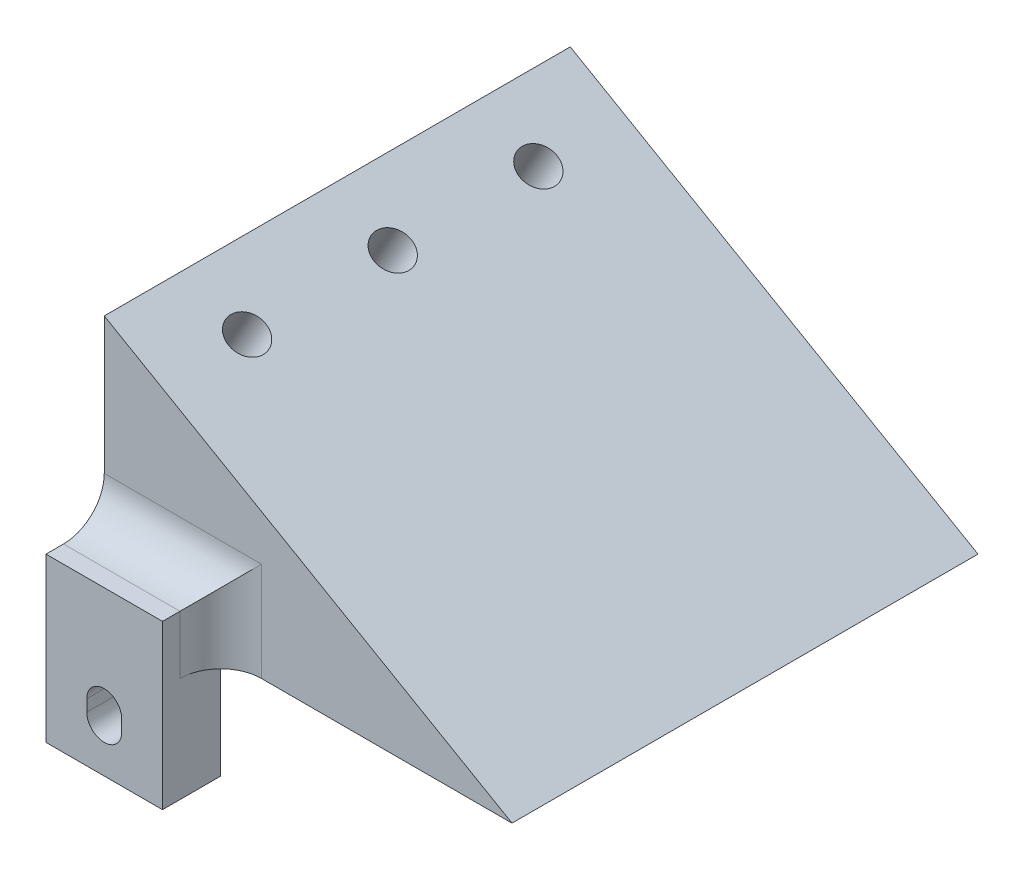
ISO-10303-21;
HEADER;
FILE_DESCRIPTION(('STEP AP214'),'2;1');
FILE_NAME('part.step','',(''),(''),'','','');
FILE_SCHEMA(('AUTOMOTIVE_DESIGN { 1 0 10303 214 1 1 1 1 }'));
ENDSEC;
DATA;
#1=APPLICATION_CONTEXT('core data for automotive mechanical design processes');
#2=APPLICATION_PROTOCOL_DEFINITION('international standard','automotive_design',2000,#1);
#3=PRODUCT_CONTEXT('',#1,'mechanical');
#4=PRODUCT('Part','Part','',(#3));
#5=PRODUCT_RELATED_PRODUCT_CATEGORY('part','',(#4));
#6=PRODUCT_DEFINITION_FORMATION('','',#4);
#7=PRODUCT_DEFINITION_CONTEXT('part definition',#1,'design');
#8=PRODUCT_DEFINITION('design','',#6,#7);
#9=PRODUCT_DEFINITION_SHAPE('','',#8);
#10=(LENGTH_UNIT() NAMED_UNIT(*) SI_UNIT(.MILLI.,.METRE.));
#11=(NAMED_UNIT(*) PLANE_ANGLE_UNIT() SI_UNIT($,.RADIAN.));
#12=(NAMED_UNIT(*) SI_UNIT($,.STERADIAN.) SOLID_ANGLE_UNIT());
#13=UNCERTAINTY_MEASURE_WITH_UNIT(LENGTH_MEASURE(1.E-05),#10,'distance_accuracy_value','');
#14=(GEOMETRIC_REPRESENTATION_CONTEXT(3) GLOBAL_UNCERTAINTY_ASSIGNED_CONTEXT((#13)) GLOBAL_UNIT_ASSIGNED_CONTEXT((#10,
#11,#12)) REPRESENTATION_CONTEXT('',''));
#15=CARTESIAN_POINT('',(0.,0.,0.));
#16=DIRECTION('',(0.,0.,1.));
#17=DIRECTION('',(1.,0.,0.));
#18=AXIS2_PLACEMENT_3D('',#15,#16,#17);
#19=CARTESIAN_POINT('',(0.,0.,0.));
#20=DIRECTION('',(0.,0.,1.));
#21=DIRECTION('',(-1.,0.,0.));
#22=AXIS2_PLACEMENT_3D('',#19,#20,#21);
#23=PLANE('',#22);
#24=DIRECTION('',(1.,0.,0.));
#25=VECTOR('',#24,1.);
#26=CARTESIAN_POINT('',(70.,0.,0.));
#27=LINE('',#26,#25);
#28=CARTESIAN_POINT('',(0.,0.,0.));
#29=VERTEX_POINT('',#28);
#30=CARTESIAN_POINT('',(20.,0.,0.));
#31=VERTEX_POINT('',#30);
#32=EDGE_CURVE('E331',#29,#31,#27,.T.);
#33=ORIENTED_EDGE('',*,*,#32,.F.);
#34=DIRECTION('',(0.,-1.,0.));
#35=VECTOR('',#34,1.);
#36=CARTESIAN_POINT('',(0.,10.,0.));
#37=LINE('',#36,#35);
#38=CARTESIAN_POINT('',(0.,-18.,0.));
#39=VERTEX_POINT('',#38);
#40=EDGE_CURVE('E241',#29,#39,#37,.T.);
#41=ORIENTED_EDGE('',*,*,#40,.T.);
#42=DIRECTION('',(1.,0.,0.));
#43=VECTOR('',#42,1.);
#44=CARTESIAN_POINT('',(20.,-18.,0.));
#45=LINE('',#44,#43);
#46=CARTESIAN_POINT('',(20.,-18.,0.));
#47=VERTEX_POINT('',#46);
#48=EDGE_CURVE('E246',#39,#47,#45,.T.);
#49=ORIENTED_EDGE('',*,*,#48,.T.);
#50=DIRECTION('',(0.,1.,0.));
#51=VECTOR('',#50,1.);
#52=CARTESIAN_POINT('',(20.,10.,0.));
#53=LINE('',#52,#51);
#54=EDGE_CURVE('E257',#47,#31,#53,.T.);
#55=ORIENTED_EDGE('',*,*,#54,.T.);
#56=EDGE_LOOP('',(#33,#41,#49,#55));
#57=FACE_BOUND('',#56,.T.);
#58=DIRECTION('',(0.,-1.,0.));
#59=VECTOR('',#58,1.);
#60=CARTESIAN_POINT('',(13.,0.,0.));
#61=LINE('',#60,#59);
#62=CARTESIAN_POINT('',(13.,-8.,0.));
#63=VERTEX_POINT('',#62);
#64=CARTESIAN_POINT('',(13.,-10.,0.));
#65=VERTEX_POINT('',#64);
#66=EDGE_CURVE('E235',#63,#65,#61,.T.);
#67=ORIENTED_EDGE('',*,*,#66,.T.);
#68=CARTESIAN_POINT('',(10.,-10.,0.));
#69=DIRECTION('',(0.,0.,1.));
#70=DIRECTION('',(1.,0.,0.));
#71=AXIS2_PLACEMENT_3D('',#68,#69,#70);
#72=CIRCLE('',#71,3.);
#73=CARTESIAN_POINT('',(7.,-10.,0.));
#74=VERTEX_POINT('',#73);
#75=EDGE_CURVE('E238',#65,#74,#72,.F.);
#76=ORIENTED_EDGE('',*,*,#75,.T.);
#77=DIRECTION('',(0.,1.,0.));
#78=VECTOR('',#77,1.);
#79=CARTESIAN_POINT('',(6.99999999999999,0.,0.));
#80=LINE('',#79,#78);
#81=CARTESIAN_POINT('',(7.,-8.,0.));
#82=VERTEX_POINT('',#81);
#83=EDGE_CURVE('E230',#74,#82,#80,.T.);
#84=ORIENTED_EDGE('',*,*,#83,.T.);
#85=CARTESIAN_POINT('',(10.,-8.,0.));
#86=DIRECTION('',(0.,0.,1.));
#87=DIRECTION('',(1.,0.,0.));
#88=AXIS2_PLACEMENT_3D('',#85,#86,#87);
#89=CIRCLE('',#88,3.);
#90=EDGE_CURVE('E206',#82,#63,#89,.F.);
#91=ORIENTED_EDGE('',*,*,#90,.T.);
#92=EDGE_LOOP('',(#67,#76,#84,#91));
#93=FACE_BOUND('',#92,.T.);
#94=ADVANCED_FACE('F37',(#57,#93),#23,.T.);
#95=CARTESIAN_POINT('',(0.,0.,-10.));
#96=DIRECTION('',(0.,0.,1.));
#97=DIRECTION('',(-1.,0.,0.));
#98=AXIS2_PLACEMENT_3D('',#95,#96,#97);
#99=PLANE('',#98);
#100=DIRECTION('',(0.,-1.,0.));
#101=VECTOR('',#100,1.);
#102=CARTESIAN_POINT('',(0.,10.,-10.));
#103=LINE('',#102,#101);
#104=CARTESIAN_POINT('',(0.,10.,-10.));
#105=VERTEX_POINT('',#104);
#106=CARTESIAN_POINT('',(0.,-18.,-10.));
#107=VERTEX_POINT('',#106);
#108=EDGE_CURVE('E242',#105,#107,#103,.T.);
#109=ORIENTED_EDGE('',*,*,#108,.F.);
#110=DIRECTION('',(-1.,0.,0.));
#111=VECTOR('',#110,1.);
#112=CARTESIAN_POINT('',(20.,10.,-10.));
#113=LINE('',#112,#111);
#114=CARTESIAN_POINT('',(20.,10.,-10.));
#115=VERTEX_POINT('',#114);
#116=EDGE_CURVE('E245',#115,#105,#113,.T.);
#117=ORIENTED_EDGE('',*,*,#116,.F.);
#118=DIRECTION('',(0.,1.,0.));
#119=VECTOR('',#118,1.);
#120=CARTESIAN_POINT('',(20.,10.,-10.));
#121=LINE('',#120,#119);
#122=CARTESIAN_POINT('',(20.,-18.,-10.));
#123=VERTEX_POINT('',#122);
#124=EDGE_CURVE('E249',#123,#115,#121,.T.);
#125=ORIENTED_EDGE('',*,*,#124,.F.);
#126=DIRECTION('',(1.,0.,0.));
#127=VECTOR('',#126,1.);
#128=CARTESIAN_POINT('',(20.,-18.,-10.));
#129=LINE('',#128,#127);
#130=EDGE_CURVE('E252',#107,#123,#129,.T.);
#131=ORIENTED_EDGE('',*,*,#130,.F.);
#132=EDGE_LOOP('',(#109,#117,#125,#131));
#133=FACE_BOUND('',#132,.T.);
#134=CARTESIAN_POINT('',(10.,-10.,-9.99999999999999));
#135=DIRECTION('',(0.,0.,1.));
#136=DIRECTION('',(1.,0.,0.));
#137=AXIS2_PLACEMENT_3D('',#134,#135,#136);
#138=CIRCLE('',#137,3.);
#139=CARTESIAN_POINT('',(7.,-10.,-10.));
#140=VERTEX_POINT('',#139);
#141=CARTESIAN_POINT('',(13.,-10.,-9.99999999999999));
#142=VERTEX_POINT('',#141);
#143=EDGE_CURVE('E219',#140,#142,#138,.T.);
#144=ORIENTED_EDGE('',*,*,#143,.T.);
#145=DIRECTION('',(0.,1.,0.));
#146=VECTOR('',#145,1.);
#147=CARTESIAN_POINT('',(13.,-10.,-9.99999999999999));
#148=LINE('',#147,#146);
#149=CARTESIAN_POINT('',(13.,-8.,-9.99999999999999));
#150=VERTEX_POINT('',#149);
#151=EDGE_CURVE('E223',#142,#150,#148,.T.);
#152=ORIENTED_EDGE('',*,*,#151,.T.);
#153=CARTESIAN_POINT('',(10.,-8.,-9.99999999999999));
#154=DIRECTION('',(0.,0.,1.));
#155=DIRECTION('',(1.,0.,0.));
#156=AXIS2_PLACEMENT_3D('',#153,#154,#155);
#157=CIRCLE('',#156,3.);
#158=CARTESIAN_POINT('',(7.,-8.,-9.99999999999999));
#159=VERTEX_POINT('',#158);
#160=EDGE_CURVE('E203',#150,#159,#157,.T.);
#161=ORIENTED_EDGE('',*,*,#160,.T.);
#162=DIRECTION('',(0.,-1.,0.));
#163=VECTOR('',#162,1.);
#164=CARTESIAN_POINT('',(7.,-10.,-9.99999999999999));
#165=LINE('',#164,#163);
#166=EDGE_CURVE('E214',#159,#140,#165,.T.);
#167=ORIENTED_EDGE('',*,*,#166,.T.);
#168=EDGE_LOOP('',(#144,#152,#161,#167));
#169=FACE_BOUND('',#168,.T.);
#170=ADVANCED_FACE('F221',(#133,#169),#99,.F.);
#171=CARTESIAN_POINT('',(0.,0.,0.));
#172=DIRECTION('',(0.,0.,-1.));
#173=DIRECTION('',(-1.,0.,0.));
#174=AXIS2_PLACEMENT_3D('',#171,#172,#173);
#175=PLANE('',#174);
#176=CARTESIAN_POINT('',(27.,0.,0.));
#177=VERTEX_POINT('',#176);
#178=CARTESIAN_POINT('',(70.,0.,0.));
#179=VERTEX_POINT('',#178);
#180=EDGE_CURVE('E320',#177,#179,#27,.T.);
#181=ORIENTED_EDGE('',*,*,#180,.F.);
#182=DIRECTION('',(0.,1.,0.));
#183=VECTOR('',#182,1.);
#184=CARTESIAN_POINT('',(27.,10.,0.));
#185=LINE('',#184,#183);
#186=CARTESIAN_POINT('',(27.,17.,0.));
#187=VERTEX_POINT('',#186);
#188=EDGE_CURVE('E373',#177,#187,#185,.T.);
#189=ORIENTED_EDGE('',*,*,#188,.T.);
#190=DIRECTION('',(-1.,0.,0.));
#191=VECTOR('',#190,1.);
#192=CARTESIAN_POINT('',(0.,17.,0.));
#193=LINE('',#192,#191);
#194=CARTESIAN_POINT('',(0.,17.,0.));
#195=VERTEX_POINT('',#194);
#196=EDGE_CURVE('E371',#187,#195,#193,.T.);
#197=ORIENTED_EDGE('',*,*,#196,.T.);
#198=DIRECTION('',(0.,-1.,0.));
#199=VECTOR('',#198,1.);
#200=CARTESIAN_POINT('',(0.,0.,0.));
#201=LINE('',#200,#199);
#202=CARTESIAN_POINT('',(0.,40.4145188432732,0.));
#203=VERTEX_POINT('',#202);
#204=EDGE_CURVE('E335',#203,#195,#201,.T.);
#205=ORIENTED_EDGE('',*,*,#204,.F.);
#206=DIRECTION('',(-0.866025403784442,0.499999999999995,0.));
#207=VECTOR('',#206,1.);
#208=CARTESIAN_POINT('',(0.,40.4145188432732,0.));
#209=LINE('',#208,#207);
#210=EDGE_CURVE('E333',#179,#203,#209,.T.);
#211=ORIENTED_EDGE('',*,*,#210,.F.);
#212=EDGE_LOOP('',(#181,#189,#197,#205,#211));
#213=FACE_BOUND('',#212,.T.);
#214=ADVANCED_FACE('F390',(#213),#175,.T.);
#215=CARTESIAN_POINT('',(0.,0.,80.));
#216=DIRECTION('',(0.,0.,-1.));
#217=DIRECTION('',(-1.,0.,0.));
#218=AXIS2_PLACEMENT_3D('',#215,#216,#217);
#219=PLANE('',#218);
#220=DIRECTION('',(-1.,0.,0.));
#221=VECTOR('',#220,1.);
#222=CARTESIAN_POINT('',(20.,17.,80.));
#223=LINE('',#222,#221);
#224=CARTESIAN_POINT('',(0.,17.,80.));
#225=VERTEX_POINT('',#224);
#226=CARTESIAN_POINT('',(27.,17.,80.));
#227=VERTEX_POINT('',#226);
#228=EDGE_CURVE('E351',#225,#227,#223,.F.);
#229=ORIENTED_EDGE('',*,*,#228,.T.);
#230=DIRECTION('',(0.,1.,0.));
#231=VECTOR('',#230,1.);
#232=CARTESIAN_POINT('',(27.,0.,80.));
#233=LINE('',#232,#231);
#234=CARTESIAN_POINT('',(27.,0.,80.));
#235=VERTEX_POINT('',#234);
#236=EDGE_CURVE('E353',#227,#235,#233,.F.);
#237=ORIENTED_EDGE('',*,*,#236,.T.);
#238=DIRECTION('',(1.,0.,0.));
#239=VECTOR('',#238,1.);
#240=CARTESIAN_POINT('',(70.,0.,80.));
#241=LINE('',#240,#239);
#242=CARTESIAN_POINT('',(70.,0.,80.));
#243=VERTEX_POINT('',#242);
#244=EDGE_CURVE('E325',#235,#243,#241,.T.);
#245=ORIENTED_EDGE('',*,*,#244,.T.);
#246=DIRECTION('',(-0.866025403784442,0.499999999999995,0.));
#247=VECTOR('',#246,1.);
#248=CARTESIAN_POINT('',(0.,40.4145188432732,80.));
#249=LINE('',#248,#247);
#250=CARTESIAN_POINT('',(0.,40.4145188432732,80.));
#251=VERTEX_POINT('',#250);
#252=EDGE_CURVE('E324',#243,#251,#249,.T.);
#253=ORIENTED_EDGE('',*,*,#252,.T.);
#254=DIRECTION('',(0.,-1.,0.));
#255=VECTOR('',#254,1.);
#256=CARTESIAN_POINT('',(0.,0.,80.));
#257=LINE('',#256,#255);
#258=EDGE_CURVE('E327',#251,#225,#257,.T.);
#259=ORIENTED_EDGE('',*,*,#258,.T.);
#260=EDGE_LOOP('',(#229,#237,#245,#253,#259));
#261=FACE_BOUND('',#260,.T.);
#262=ADVANCED_FACE('F530',(#261),#219,.F.);
#263=CARTESIAN_POINT('',(70.,0.,80.));
#264=DIRECTION('',(0.,1.,0.));
#265=DIRECTION('',(-1.,0.,0.));
#266=AXIS2_PLACEMENT_3D('',#263,#264,#265);
#267=PLANE('',#266);
#268=ORIENTED_EDGE('',*,*,#32,.T.);
#269=DIRECTION('',(0.,0.,1.));
#270=VECTOR('',#269,1.);
#271=CARTESIAN_POINT('',(20.,0.,-10.));
#272=LINE('',#271,#270);
#273=CARTESIAN_POINT('',(20.,0.,-7.));
#274=VERTEX_POINT('',#273);
#275=EDGE_CURVE('E59',#274,#31,#272,.T.);
#276=ORIENTED_EDGE('',*,*,#275,.F.);
#277=CARTESIAN_POINT('',(27.,0.,-7.));
#278=DIRECTION('',(0.,1.,0.));
#279=DIRECTION('',(-1.,0.,0.));
#280=AXIS2_PLACEMENT_3D('',#277,#278,#279);
#281=CIRCLE('',#280,7.);
#282=EDGE_CURVE('E46',#274,#177,#281,.T.);
#283=ORIENTED_EDGE('',*,*,#282,.T.);
#284=ORIENTED_EDGE('',*,*,#180,.T.);
#285=DIRECTION('',(0.,0.,-1.));
#286=VECTOR('',#285,1.);
#287=CARTESIAN_POINT('',(70.,0.,80.));
#288=LINE('',#287,#286);
#289=EDGE_CURVE('E342',#243,#179,#288,.T.);
#290=ORIENTED_EDGE('',*,*,#289,.F.);
#291=ORIENTED_EDGE('',*,*,#244,.F.);
#292=CARTESIAN_POINT('',(27.,0.,87.));
#293=DIRECTION('',(0.,1.,0.));
#294=DIRECTION('',(-1.,0.,0.));
#295=AXIS2_PLACEMENT_3D('',#292,#293,#294);
#296=CIRCLE('',#295,7.);
#297=CARTESIAN_POINT('',(20.,0.,87.));
#298=VERTEX_POINT('',#297);
#299=EDGE_CURVE('E357',#235,#298,#296,.T.);
#300=ORIENTED_EDGE('',*,*,#299,.T.);
#301=DIRECTION('',(0.,0.,1.));
#302=VECTOR('',#301,1.);
#303=CARTESIAN_POINT('',(20.,0.,80.));
#304=LINE('',#303,#302);
#305=CARTESIAN_POINT('',(20.,0.,80.));
#306=VERTEX_POINT('',#305);
#307=EDGE_CURVE('E345',#306,#298,#304,.T.);
#308=ORIENTED_EDGE('',*,*,#307,.F.);
#309=CARTESIAN_POINT('',(0.,0.,80.));
#310=VERTEX_POINT('',#309);
#311=EDGE_CURVE('E321',#310,#306,#241,.T.);
#312=ORIENTED_EDGE('',*,*,#311,.F.);
#313=DIRECTION('',(0.,0.,-1.));
#314=VECTOR('',#313,1.);
#315=CARTESIAN_POINT('',(0.,0.,80.));
#316=LINE('',#315,#314);
#317=EDGE_CURVE('E330',#310,#29,#316,.T.);
#318=ORIENTED_EDGE('',*,*,#317,.T.);
#319=EDGE_LOOP('',(#268,#276,#283,#284,#290,#291,#300,#308,#312,#318));
#320=FACE_BOUND('',#319,.T.);
#321=ADVANCED_FACE('F383',(#320),#267,.F.);
#322=CARTESIAN_POINT('',(0.,40.4145188432732,80.));
#323=DIRECTION('',(-0.499999999999995,-0.866025403784442,0.));
#324=DIRECTION('',(0.866025403784442,-0.499999999999995,0.));
#325=AXIS2_PLACEMENT_3D('',#322,#323,#324);
#326=PLANE('',#325);
#327=CARTESIAN_POINT('',(9.52627944162887,34.9145188432733,15.));
#328=DIRECTION('',(0.499999999999995,0.866025403784442,0.));
#329=DIRECTION('',(-0.866025403784442,0.499999999999995,0.));
#330=AXIS2_PLACEMENT_3D('',#327,#328,#329);
#331=CIRCLE('',#330,3.2);
#332=CARTESIAN_POINT('',(6.75499814951865,36.5145188432733,15.));
#333=VERTEX_POINT('',#332);
#334=EDGE_CURVE('E501',#333,#333,#331,.T.);
#335=ORIENTED_EDGE('',*,*,#334,.F.);
#336=EDGE_LOOP('',(#335));
#337=FACE_BOUND('',#336,.T.);
#338=CARTESIAN_POINT('',(9.52627944162887,34.9145188432733,65.));
#339=DIRECTION('',(0.499999999999995,0.866025403784442,0.));
#340=DIRECTION('',(-0.866025403784442,0.499999999999995,0.));
#341=AXIS2_PLACEMENT_3D('',#338,#339,#340);
#342=CIRCLE('',#341,3.19999999999999);
#343=CARTESIAN_POINT('',(6.75499814951866,36.5145188432733,65.));
#344=VERTEX_POINT('',#343);
#345=EDGE_CURVE('E509',#344,#344,#342,.T.);
#346=ORIENTED_EDGE('',*,*,#345,.F.);
#347=EDGE_LOOP('',(#346));
#348=FACE_BOUND('',#347,.T.);
#349=CARTESIAN_POINT('',(9.52627944162887,34.9145188432733,40.));
#350=DIRECTION('',(0.499999999999995,0.866025403784442,0.));
#351=DIRECTION('',(-0.866025403784442,0.499999999999995,0.));
#352=AXIS2_PLACEMENT_3D('',#349,#350,#351);
#353=CIRCLE('',#352,3.2);
#354=CARTESIAN_POINT('',(6.75499814951865,36.5145188432733,40.));
#355=VERTEX_POINT('',#354);
#356=EDGE_CURVE('E515',#355,#355,#353,.T.);
#357=ORIENTED_EDGE('',*,*,#356,.F.);
#358=EDGE_LOOP('',(#357));
#359=FACE_BOUND('',#358,.T.);
#360=ORIENTED_EDGE('',*,*,#210,.T.);
#361=DIRECTION('',(0.,0.,-1.));
#362=VECTOR('',#361,1.);
#363=CARTESIAN_POINT('',(0.,40.4145188432732,80.));
#364=LINE('',#363,#362);
#365=EDGE_CURVE('E339',#251,#203,#364,.T.);
#366=ORIENTED_EDGE('',*,*,#365,.F.);
#367=ORIENTED_EDGE('',*,*,#252,.F.);
#368=ORIENTED_EDGE('',*,*,#289,.T.);
#369=EDGE_LOOP('',(#360,#366,#367,#368));
#370=FACE_BOUND('',#369,.T.);
#371=ADVANCED_FACE('F403',(#337,#348,#359,#370),#326,.F.);
#372=CARTESIAN_POINT('',(0.,0.,80.));
#373=DIRECTION('',(1.,0.,0.));
#374=DIRECTION('',(0.,0.,-1.));
#375=AXIS2_PLACEMENT_3D('',#372,#373,#374);
#376=PLANE('',#375);
#377=ORIENTED_EDGE('',*,*,#204,.T.);
#378=CARTESIAN_POINT('',(0.,17.,-7.));
#379=DIRECTION('',(1.,0.,0.));
#380=DIRECTION('',(0.,0.,-1.));
#381=AXIS2_PLACEMENT_3D('',#378,#379,#380);
#382=CIRCLE('',#381,7.);
#383=CARTESIAN_POINT('',(0.,10.,-7.));
#384=VERTEX_POINT('',#383);
#385=EDGE_CURVE('E11',#195,#384,#382,.T.);
#386=ORIENTED_EDGE('',*,*,#385,.T.);
#387=DIRECTION('',(0.,0.,1.));
#388=VECTOR('',#387,1.);
#389=CARTESIAN_POINT('',(0.,10.,-10.));
#390=LINE('',#389,#388);
#391=EDGE_CURVE('E269',#105,#384,#390,.T.);
#392=ORIENTED_EDGE('',*,*,#391,.F.);
#393=ORIENTED_EDGE('',*,*,#108,.T.);
#394=DIRECTION('',(0.,0.,1.));
#395=VECTOR('',#394,1.);
#396=CARTESIAN_POINT('',(0.,-18.,-10.));
#397=LINE('',#396,#395);
#398=EDGE_CURVE('E255',#107,#39,#397,.T.);
#399=ORIENTED_EDGE('',*,*,#398,.T.);
#400=ORIENTED_EDGE('',*,*,#40,.F.);
#401=ORIENTED_EDGE('',*,*,#317,.F.);
#402=DIRECTION('',(0.,-1.,0.));
#403=VECTOR('',#402,1.);
#404=CARTESIAN_POINT('',(0.,10.,80.));
#405=LINE('',#404,#403);
#406=CARTESIAN_POINT('',(0.,-18.,80.));
#407=VERTEX_POINT('',#406);
#408=EDGE_CURVE('E303',#310,#407,#405,.T.);
#409=ORIENTED_EDGE('',*,*,#408,.T.);
#410=DIRECTION('',(0.,0.,-1.));
#411=VECTOR('',#410,1.);
#412=CARTESIAN_POINT('',(0.,-18.,90.));
#413=LINE('',#412,#411);
#414=CARTESIAN_POINT('',(0.,-18.,90.));
#415=VERTEX_POINT('',#414);
#416=EDGE_CURVE('E317',#415,#407,#413,.T.);
#417=ORIENTED_EDGE('',*,*,#416,.F.);
#418=DIRECTION('',(0.,-1.,0.));
#419=VECTOR('',#418,1.);
#420=CARTESIAN_POINT('',(0.,10.,90.));
#421=LINE('',#420,#419);
#422=CARTESIAN_POINT('',(0.,10.,90.));
#423=VERTEX_POINT('',#422);
#424=EDGE_CURVE('E292',#423,#415,#421,.T.);
#425=ORIENTED_EDGE('',*,*,#424,.F.);
#426=DIRECTION('',(0.,0.,-1.));
#427=VECTOR('',#426,1.);
#428=CARTESIAN_POINT('',(0.,10.,90.));
#429=LINE('',#428,#427);
#430=CARTESIAN_POINT('',(0.,10.,87.));
#431=VERTEX_POINT('',#430);
#432=EDGE_CURVE('E302',#423,#431,#429,.T.);
#433=ORIENTED_EDGE('',*,*,#432,.T.);
#434=CARTESIAN_POINT('',(0.,17.,87.));
#435=DIRECTION('',(1.,0.,0.));
#436=DIRECTION('',(0.,0.,-1.));
#437=AXIS2_PLACEMENT_3D('',#434,#435,#436);
#438=CIRCLE('',#437,7.);
#439=EDGE_CURVE('E359',#431,#225,#438,.T.);
#440=ORIENTED_EDGE('',*,*,#439,.T.);
#441=ORIENTED_EDGE('',*,*,#258,.F.);
#442=ORIENTED_EDGE('',*,*,#365,.T.);
#443=EDGE_LOOP('',(#377,#386,#392,#393,#399,#400,#401,#409,#417,#425,#433,#440,#441,#442));
#444=FACE_BOUND('',#443,.T.);
#445=ADVANCED_FACE('F398',(#444),#376,.F.);
#446=CARTESIAN_POINT('',(20.,-18.,90.));
#447=DIRECTION('',(0.,1.,0.));
#448=DIRECTION('',(-1.,0.,0.));
#449=AXIS2_PLACEMENT_3D('',#446,#447,#448);
#450=PLANE('',#449);
#451=DIRECTION('',(1.,0.,0.));
#452=VECTOR('',#451,1.);
#453=CARTESIAN_POINT('',(20.,-18.,80.));
#454=LINE('',#453,#452);
#455=CARTESIAN_POINT('',(20.,-18.,80.));
#456=VERTEX_POINT('',#455);
#457=EDGE_CURVE('E305',#407,#456,#454,.T.);
#458=ORIENTED_EDGE('',*,*,#457,.T.);
#459=DIRECTION('',(0.,0.,-1.));
#460=VECTOR('',#459,1.);
#461=CARTESIAN_POINT('',(20.,-18.,90.));
#462=LINE('',#461,#460);
#463=CARTESIAN_POINT('',(20.,-18.,90.));
#464=VERTEX_POINT('',#463);
#465=EDGE_CURVE('E314',#464,#456,#462,.T.);
#466=ORIENTED_EDGE('',*,*,#465,.F.);
#467=DIRECTION('',(1.,0.,0.));
#468=VECTOR('',#467,1.);
#469=CARTESIAN_POINT('',(20.,-18.,90.));
#470=LINE('',#469,#468);
#471=EDGE_CURVE('E295',#415,#464,#470,.T.);
#472=ORIENTED_EDGE('',*,*,#471,.F.);
#473=ORIENTED_EDGE('',*,*,#416,.T.);
#474=EDGE_LOOP('',(#458,#466,#472,#473));
#475=FACE_BOUND('',#474,.T.);
#476=ADVANCED_FACE('F528',(#475),#450,.F.);
#477=CARTESIAN_POINT('',(20.,10.,90.));
#478=DIRECTION('',(-1.,0.,0.));
#479=DIRECTION('',(0.,-1.,0.));
#480=AXIS2_PLACEMENT_3D('',#477,#478,#479);
#481=PLANE('',#480);
#482=ORIENTED_EDGE('',*,*,#307,.T.);
#483=DIRECTION('',(0.,1.,0.));
#484=VECTOR('',#483,1.);
#485=CARTESIAN_POINT('',(20.,10.,87.));
#486=LINE('',#485,#484);
#487=CARTESIAN_POINT('',(20.,10.,87.));
#488=VERTEX_POINT('',#487);
#489=EDGE_CURVE('E348',#298,#488,#486,.T.);
#490=ORIENTED_EDGE('',*,*,#489,.T.);
#491=DIRECTION('',(0.,0.,-1.));
#492=VECTOR('',#491,1.);
#493=CARTESIAN_POINT('',(20.,10.,90.));
#494=LINE('',#493,#492);
#495=CARTESIAN_POINT('',(20.,10.,90.));
#496=VERTEX_POINT('',#495);
#497=EDGE_CURVE('E311',#496,#488,#494,.T.);
#498=ORIENTED_EDGE('',*,*,#497,.F.);
#499=DIRECTION('',(0.,1.,0.));
#500=VECTOR('',#499,1.);
#501=CARTESIAN_POINT('',(20.,10.,90.));
#502=LINE('',#501,#500);
#503=EDGE_CURVE('E298',#464,#496,#502,.T.);
#504=ORIENTED_EDGE('',*,*,#503,.F.);
#505=ORIENTED_EDGE('',*,*,#465,.T.);
#506=DIRECTION('',(0.,1.,0.));
#507=VECTOR('',#506,1.);
#508=CARTESIAN_POINT('',(20.,10.,80.));
#509=LINE('',#508,#507);
#510=EDGE_CURVE('E296',#456,#306,#509,.T.);
#511=ORIENTED_EDGE('',*,*,#510,.T.);
#512=EDGE_LOOP('',(#482,#490,#498,#504,#505,#511));
#513=FACE_BOUND('',#512,.T.);
#514=ADVANCED_FACE('F415',(#513),#481,.F.);
#515=CARTESIAN_POINT('',(20.,10.,90.));
#516=DIRECTION('',(0.,-1.,0.));
#517=DIRECTION('',(1.,0.,0.));
#518=AXIS2_PLACEMENT_3D('',#515,#516,#517);
#519=PLANE('',#518);
#520=ORIENTED_EDGE('',*,*,#497,.T.);
#521=DIRECTION('',(-1.,0.,0.));
#522=VECTOR('',#521,1.);
#523=CARTESIAN_POINT('',(0.,10.,87.));
#524=LINE('',#523,#522);
#525=EDGE_CURVE('E355',#488,#431,#524,.T.);
#526=ORIENTED_EDGE('',*,*,#525,.T.);
#527=ORIENTED_EDGE('',*,*,#432,.F.);
#528=DIRECTION('',(-1.,0.,0.));
#529=VECTOR('',#528,1.);
#530=CARTESIAN_POINT('',(20.,10.,90.));
#531=LINE('',#530,#529);
#532=EDGE_CURVE('E300',#496,#423,#531,.T.);
#533=ORIENTED_EDGE('',*,*,#532,.F.);
#534=EDGE_LOOP('',(#520,#526,#527,#533));
#535=FACE_BOUND('',#534,.T.);
#536=ADVANCED_FACE('F419',(#535),#519,.F.);
#537=CARTESIAN_POINT('',(0.,0.,90.));
#538=DIRECTION('',(0.,0.,-1.));
#539=DIRECTION('',(-1.,0.,0.));
#540=AXIS2_PLACEMENT_3D('',#537,#538,#539);
#541=PLANE('',#540);
#542=DIRECTION('',(0.,1.,0.));
#543=VECTOR('',#542,1.);
#544=CARTESIAN_POINT('',(13.,-10.,90.));
#545=LINE('',#544,#543);
#546=CARTESIAN_POINT('',(13.,-10.,90.));
#547=VERTEX_POINT('',#546);
#548=CARTESIAN_POINT('',(13.,-8.,90.));
#549=VERTEX_POINT('',#548);
#550=EDGE_CURVE('E273',#547,#549,#545,.T.);
#551=ORIENTED_EDGE('',*,*,#550,.F.);
#552=CARTESIAN_POINT('',(10.,-10.,90.));
#553=DIRECTION('',(0.,0.,1.));
#554=DIRECTION('',(1.,0.,0.));
#555=AXIS2_PLACEMENT_3D('',#552,#553,#554);
#556=CIRCLE('',#555,3.);
#557=CARTESIAN_POINT('',(7.,-10.,90.));
#558=VERTEX_POINT('',#557);
#559=EDGE_CURVE('E271',#558,#547,#556,.T.);
#560=ORIENTED_EDGE('',*,*,#559,.F.);
#561=DIRECTION('',(0.,-1.,0.));
#562=VECTOR('',#561,1.);
#563=CARTESIAN_POINT('',(7.,-10.,90.));
#564=LINE('',#563,#562);
#565=CARTESIAN_POINT('',(7.,-8.,90.));
#566=VERTEX_POINT('',#565);
#567=EDGE_CURVE('E279',#566,#558,#564,.T.);
#568=ORIENTED_EDGE('',*,*,#567,.F.);
#569=CARTESIAN_POINT('',(10.,-8.,90.));
#570=DIRECTION('',(0.,0.,1.));
#571=DIRECTION('',(1.,0.,0.));
#572=AXIS2_PLACEMENT_3D('',#569,#570,#571);
#573=CIRCLE('',#572,3.);
#574=EDGE_CURVE('E276',#549,#566,#573,.T.);
#575=ORIENTED_EDGE('',*,*,#574,.F.);
#576=EDGE_LOOP('',(#551,#560,#568,#575));
#577=FACE_BOUND('',#576,.T.);
#578=ORIENTED_EDGE('',*,*,#424,.T.);
#579=ORIENTED_EDGE('',*,*,#471,.T.);
#580=ORIENTED_EDGE('',*,*,#503,.T.);
#581=ORIENTED_EDGE('',*,*,#532,.T.);
#582=EDGE_LOOP('',(#578,#579,#580,#581));
#583=FACE_BOUND('',#582,.T.);
#584=ADVANCED_FACE('F423',(#577,#583),#541,.F.);
#585=CARTESIAN_POINT('',(0.,0.,80.));
#586=DIRECTION('',(0.,0.,-1.));
#587=DIRECTION('',(-1.,0.,0.));
#588=AXIS2_PLACEMENT_3D('',#585,#586,#587);
#589=PLANE('',#588);
#590=CARTESIAN_POINT('',(10.,-10.,80.));
#591=DIRECTION('',(0.,0.,-1.));
#592=DIRECTION('',(-1.,0.,0.));
#593=AXIS2_PLACEMENT_3D('',#590,#591,#592);
#594=CIRCLE('',#593,3.);
#595=CARTESIAN_POINT('',(13.,-10.,80.));
#596=VERTEX_POINT('',#595);
#597=CARTESIAN_POINT('',(7.,-10.,80.));
#598=VERTEX_POINT('',#597);
#599=EDGE_CURVE('E369',#596,#598,#594,.T.);
#600=ORIENTED_EDGE('',*,*,#599,.F.);
#601=DIRECTION('',(0.,-1.,0.));
#602=VECTOR('',#601,1.);
#603=CARTESIAN_POINT('',(13.,0.,80.));
#604=LINE('',#603,#602);
#605=CARTESIAN_POINT('',(13.,-8.,80.));
#606=VERTEX_POINT('',#605);
#607=EDGE_CURVE('E361',#606,#596,#604,.T.);
#608=ORIENTED_EDGE('',*,*,#607,.F.);
#609=CARTESIAN_POINT('',(10.,-8.,80.));
#610=DIRECTION('',(0.,0.,-1.));
#611=DIRECTION('',(-1.,0.,0.));
#612=AXIS2_PLACEMENT_3D('',#609,#610,#611);
#613=CIRCLE('',#612,3.);
#614=CARTESIAN_POINT('',(7.,-8.,80.));
#615=VERTEX_POINT('',#614);
#616=EDGE_CURVE('E364',#615,#606,#613,.T.);
#617=ORIENTED_EDGE('',*,*,#616,.F.);
#618=DIRECTION('',(0.,1.,0.));
#619=VECTOR('',#618,1.);
#620=CARTESIAN_POINT('',(6.99999999999999,0.,80.));
#621=LINE('',#620,#619);
#622=EDGE_CURVE('E367',#598,#615,#621,.T.);
#623=ORIENTED_EDGE('',*,*,#622,.F.);
#624=EDGE_LOOP('',(#600,#608,#617,#623));
#625=FACE_BOUND('',#624,.T.);
#626=ORIENTED_EDGE('',*,*,#408,.F.);
#627=ORIENTED_EDGE('',*,*,#311,.T.);
#628=ORIENTED_EDGE('',*,*,#510,.F.);
#629=ORIENTED_EDGE('',*,*,#457,.F.);
#630=EDGE_LOOP('',(#626,#627,#628,#629));
#631=FACE_BOUND('',#630,.T.);
#632=ADVANCED_FACE('F431',(#625,#631),#589,.T.);
#633=CARTESIAN_POINT('',(20.,17.,87.));
#634=DIRECTION('',(1.,0.,0.));
#635=DIRECTION('',(0.,1.,0.));
#636=AXIS2_PLACEMENT_3D('',#633,#634,#635);
#637=CYLINDRICAL_SURFACE('',#636,7.);
#638=ORIENTED_EDGE('',*,*,#439,.F.);
#639=ORIENTED_EDGE('',*,*,#525,.F.);
#640=CARTESIAN_POINT('',(27.,17.,87.));
#641=DIRECTION('',(0.707106781186548,-0.707106781186547,0.));
#642=DIRECTION('',(0.707106781186547,0.707106781186548,0.));
#643=AXIS2_PLACEMENT_3D('',#640,#641,#642);
#644=ELLIPSE('',#643,9.89949493661167,7.);
#645=EDGE_CURVE('E285',#227,#488,#644,.F.);
#646=ORIENTED_EDGE('',*,*,#645,.F.);
#647=ORIENTED_EDGE('',*,*,#228,.F.);
#648=EDGE_LOOP('',(#638,#639,#646,#647));
#649=FACE_BOUND('',#648,.T.);
#650=ADVANCED_FACE('F539',(#649),#637,.F.);
#651=CARTESIAN_POINT('',(27.,10.,87.));
#652=DIRECTION('',(0.,-1.,0.));
#653=DIRECTION('',(1.,0.,0.));
#654=AXIS2_PLACEMENT_3D('',#651,#652,#653);
#655=CYLINDRICAL_SURFACE('',#654,7.);
#656=ORIENTED_EDGE('',*,*,#299,.F.);
#657=ORIENTED_EDGE('',*,*,#236,.F.);
#658=ORIENTED_EDGE('',*,*,#645,.T.);
#659=ORIENTED_EDGE('',*,*,#489,.F.);
#660=EDGE_LOOP('',(#656,#657,#658,#659));
#661=FACE_BOUND('',#660,.T.);
#662=ADVANCED_FACE('F410',(#661),#655,.F.);
#663=CARTESIAN_POINT('',(10.,-10.,70.));
#664=DIRECTION('',(0.,0.,1.));
#665=DIRECTION('',(1.,0.,0.));
#666=AXIS2_PLACEMENT_3D('',#663,#664,#665);
#667=CYLINDRICAL_SURFACE('',#666,3.);
#668=ORIENTED_EDGE('',*,*,#599,.T.);
#669=DIRECTION('',(0.,0.,1.));
#670=VECTOR('',#669,1.);
#671=CARTESIAN_POINT('',(7.,-10.,70.));
#672=LINE('',#671,#670);
#673=EDGE_CURVE('E283',#598,#558,#672,.T.);
#674=ORIENTED_EDGE('',*,*,#673,.T.);
#675=ORIENTED_EDGE('',*,*,#559,.T.);
#676=DIRECTION('',(0.,0.,1.));
#677=VECTOR('',#676,1.);
#678=CARTESIAN_POINT('',(13.,-10.,70.));
#679=LINE('',#678,#677);
#680=EDGE_CURVE('E282',#596,#547,#679,.T.);
#681=ORIENTED_EDGE('',*,*,#680,.F.);
#682=EDGE_LOOP('',(#668,#674,#675,#681));
#683=FACE_BOUND('',#682,.T.);
#684=ADVANCED_FACE('F538',(#683),#667,.F.);
#685=CARTESIAN_POINT('',(7.,-10.,70.));
#686=DIRECTION('',(-1.,0.,0.));
#687=DIRECTION('',(0.,-1.,0.));
#688=AXIS2_PLACEMENT_3D('',#685,#686,#687);
#689=PLANE('',#688);
#690=ORIENTED_EDGE('',*,*,#622,.T.);
#691=DIRECTION('',(0.,0.,1.));
#692=VECTOR('',#691,1.);
#693=CARTESIAN_POINT('',(7.,-8.,70.));
#694=LINE('',#693,#692);
#695=EDGE_CURVE('E286',#615,#566,#694,.T.);
#696=ORIENTED_EDGE('',*,*,#695,.T.);
#697=ORIENTED_EDGE('',*,*,#567,.T.);
#698=ORIENTED_EDGE('',*,*,#673,.F.);
#699=EDGE_LOOP('',(#690,#696,#697,#698));
#700=FACE_BOUND('',#699,.T.);
#701=ADVANCED_FACE('F604',(#700),#689,.F.);
#702=CARTESIAN_POINT('',(10.,-8.,70.));
#703=DIRECTION('',(0.,0.,1.));
#704=DIRECTION('',(1.,0.,0.));
#705=AXIS2_PLACEMENT_3D('',#702,#703,#704);
#706=CYLINDRICAL_SURFACE('',#705,3.);
#707=ORIENTED_EDGE('',*,*,#616,.T.);
#708=DIRECTION('',(0.,0.,1.));
#709=VECTOR('',#708,1.);
#710=CARTESIAN_POINT('',(13.,-8.,70.));
#711=LINE('',#710,#709);
#712=EDGE_CURVE('E288',#606,#549,#711,.T.);
#713=ORIENTED_EDGE('',*,*,#712,.T.);
#714=ORIENTED_EDGE('',*,*,#574,.T.);
#715=ORIENTED_EDGE('',*,*,#695,.F.);
#716=EDGE_LOOP('',(#707,#713,#714,#715));
#717=FACE_BOUND('',#716,.T.);
#718=ADVANCED_FACE('F592',(#717),#706,.F.);
#719=CARTESIAN_POINT('',(13.,-10.,70.));
#720=DIRECTION('',(1.,0.,0.));
#721=DIRECTION('',(0.,1.,0.));
#722=AXIS2_PLACEMENT_3D('',#719,#720,#721);
#723=PLANE('',#722);
#724=ORIENTED_EDGE('',*,*,#607,.T.);
#725=ORIENTED_EDGE('',*,*,#680,.T.);
#726=ORIENTED_EDGE('',*,*,#550,.T.);
#727=ORIENTED_EDGE('',*,*,#712,.F.);
#728=EDGE_LOOP('',(#724,#725,#726,#727));
#729=FACE_BOUND('',#728,.T.);
#730=ADVANCED_FACE('F587',(#729),#723,.F.);
#731=CARTESIAN_POINT('',(20.,10.,-10.));
#732=DIRECTION('',(0.,1.,0.));
#733=DIRECTION('',(-1.,0.,0.));
#734=AXIS2_PLACEMENT_3D('',#731,#732,#733);
#735=PLANE('',#734);
#736=ORIENTED_EDGE('',*,*,#391,.T.);
#737=DIRECTION('',(-1.,0.,0.));
#738=VECTOR('',#737,1.);
#739=CARTESIAN_POINT('',(20.,10.,-7.));
#740=LINE('',#739,#738);
#741=CARTESIAN_POINT('',(20.,10.,-7.));
#742=VERTEX_POINT('',#741);
#743=EDGE_CURVE('E379',#384,#742,#740,.F.);
#744=ORIENTED_EDGE('',*,*,#743,.T.);
#745=DIRECTION('',(0.,0.,1.));
#746=VECTOR('',#745,1.);
#747=CARTESIAN_POINT('',(20.,10.,-10.));
#748=LINE('',#747,#746);
#749=EDGE_CURVE('E266',#115,#742,#748,.T.);
#750=ORIENTED_EDGE('',*,*,#749,.F.);
#751=ORIENTED_EDGE('',*,*,#116,.T.);
#752=EDGE_LOOP('',(#736,#744,#750,#751));
#753=FACE_BOUND('',#752,.T.);
#754=ADVANCED_FACE('F443',(#753),#735,.T.);
#755=CARTESIAN_POINT('',(20.,10.,-10.));
#756=DIRECTION('',(1.,0.,0.));
#757=DIRECTION('',(0.,1.,0.));
#758=AXIS2_PLACEMENT_3D('',#755,#756,#757);
#759=PLANE('',#758);
#760=ORIENTED_EDGE('',*,*,#749,.T.);
#761=DIRECTION('',(0.,1.,0.));
#762=VECTOR('',#761,1.);
#763=CARTESIAN_POINT('',(20.,0.,-7.));
#764=LINE('',#763,#762);
#765=EDGE_CURVE('E377',#742,#274,#764,.F.);
#766=ORIENTED_EDGE('',*,*,#765,.T.);
#767=ORIENTED_EDGE('',*,*,#275,.T.);
#768=ORIENTED_EDGE('',*,*,#54,.F.);
#769=DIRECTION('',(0.,0.,1.));
#770=VECTOR('',#769,1.);
#771=CARTESIAN_POINT('',(20.,-18.,-10.));
#772=LINE('',#771,#770);
#773=EDGE_CURVE('E264',#123,#47,#772,.T.);
#774=ORIENTED_EDGE('',*,*,#773,.F.);
#775=ORIENTED_EDGE('',*,*,#124,.T.);
#776=EDGE_LOOP('',(#760,#766,#767,#768,#774,#775));
#777=FACE_BOUND('',#776,.T.);
#778=ADVANCED_FACE('F439',(#777),#759,.T.);
#779=CARTESIAN_POINT('',(20.,-18.,-10.));
#780=DIRECTION('',(0.,-1.,0.));
#781=DIRECTION('',(1.,0.,0.));
#782=AXIS2_PLACEMENT_3D('',#779,#780,#781);
#783=PLANE('',#782);
#784=ORIENTED_EDGE('',*,*,#48,.F.);
#785=ORIENTED_EDGE('',*,*,#398,.F.);
#786=ORIENTED_EDGE('',*,*,#130,.T.);
#787=ORIENTED_EDGE('',*,*,#773,.T.);
#788=EDGE_LOOP('',(#784,#785,#786,#787));
#789=FACE_BOUND('',#788,.T.);
#790=ADVANCED_FACE('F448',(#789),#783,.T.);
#791=CARTESIAN_POINT('',(10.,-10.,10.));
#792=DIRECTION('',(0.,0.,-1.));
#793=DIRECTION('',(-1.,0.,0.));
#794=AXIS2_PLACEMENT_3D('',#791,#792,#793);
#795=CYLINDRICAL_SURFACE('',#794,3.);
#796=DIRECTION('',(0.,0.,-1.));
#797=VECTOR('',#796,1.);
#798=CARTESIAN_POINT('',(13.,-10.,10.));
#799=LINE('',#798,#797);
#800=EDGE_CURVE('E228',#65,#142,#799,.T.);
#801=ORIENTED_EDGE('',*,*,#800,.T.);
#802=ORIENTED_EDGE('',*,*,#143,.F.);
#803=DIRECTION('',(0.,0.,-1.));
#804=VECTOR('',#803,1.);
#805=CARTESIAN_POINT('',(7.,-10.,10.));
#806=LINE('',#805,#804);
#807=EDGE_CURVE('E210',#74,#140,#806,.T.);
#808=ORIENTED_EDGE('',*,*,#807,.F.);
#809=ORIENTED_EDGE('',*,*,#75,.F.);
#810=EDGE_LOOP('',(#801,#802,#808,#809));
#811=FACE_BOUND('',#810,.T.);
#812=ADVANCED_FACE('F450',(#811),#795,.F.);
#813=CARTESIAN_POINT('',(13.,-10.,10.));
#814=DIRECTION('',(-1.,0.,0.));
#815=DIRECTION('',(0.,-1.,0.));
#816=AXIS2_PLACEMENT_3D('',#813,#814,#815);
#817=PLANE('',#816);
#818=DIRECTION('',(0.,0.,-1.));
#819=VECTOR('',#818,1.);
#820=CARTESIAN_POINT('',(13.,-8.,10.));
#821=LINE('',#820,#819);
#822=EDGE_CURVE('E209',#63,#150,#821,.T.);
#823=ORIENTED_EDGE('',*,*,#822,.T.);
#824=ORIENTED_EDGE('',*,*,#151,.F.);
#825=ORIENTED_EDGE('',*,*,#800,.F.);
#826=ORIENTED_EDGE('',*,*,#66,.F.);
#827=EDGE_LOOP('',(#823,#824,#825,#826));
#828=FACE_BOUND('',#827,.T.);
#829=ADVANCED_FACE('F456',(#828),#817,.T.);
#830=CARTESIAN_POINT('',(10.,-8.,10.));
#831=DIRECTION('',(0.,0.,-1.));
#832=DIRECTION('',(-1.,0.,0.));
#833=AXIS2_PLACEMENT_3D('',#830,#831,#832);
#834=CYLINDRICAL_SURFACE('',#833,3.);
#835=DIRECTION('',(0.,0.,-1.));
#836=VECTOR('',#835,1.);
#837=CARTESIAN_POINT('',(7.,-8.,10.));
#838=LINE('',#837,#836);
#839=EDGE_CURVE('E198',#82,#159,#838,.T.);
#840=ORIENTED_EDGE('',*,*,#839,.T.);
#841=ORIENTED_EDGE('',*,*,#160,.F.);
#842=ORIENTED_EDGE('',*,*,#822,.F.);
#843=ORIENTED_EDGE('',*,*,#90,.F.);
#844=EDGE_LOOP('',(#840,#841,#842,#843));
#845=FACE_BOUND('',#844,.T.);
#846=ADVANCED_FACE('F200',(#845),#834,.F.);
#847=CARTESIAN_POINT('',(7.,-10.,10.));
#848=DIRECTION('',(1.,0.,0.));
#849=DIRECTION('',(0.,1.,0.));
#850=AXIS2_PLACEMENT_3D('',#847,#848,#849);
#851=PLANE('',#850);
#852=ORIENTED_EDGE('',*,*,#807,.T.);
#853=ORIENTED_EDGE('',*,*,#166,.F.);
#854=ORIENTED_EDGE('',*,*,#839,.F.);
#855=ORIENTED_EDGE('',*,*,#83,.F.);
#856=EDGE_LOOP('',(#852,#853,#854,#855));
#857=FACE_BOUND('',#856,.T.);
#858=ADVANCED_FACE('F215',(#857),#851,.T.);
#859=CARTESIAN_POINT('',(0.,17.,-7.));
#860=DIRECTION('',(1.,0.,0.));
#861=DIRECTION('',(0.,1.,0.));
#862=AXIS2_PLACEMENT_3D('',#859,#860,#861);
#863=CYLINDRICAL_SURFACE('',#862,7.);
#864=ORIENTED_EDGE('',*,*,#385,.F.);
#865=ORIENTED_EDGE('',*,*,#196,.F.);
#866=CARTESIAN_POINT('',(27.,17.,-7.));
#867=DIRECTION('',(0.707106781186548,-0.707106781186547,0.));
#868=DIRECTION('',(0.707106781186547,0.707106781186548,0.));
#869=AXIS2_PLACEMENT_3D('',#866,#867,#868);
#870=ELLIPSE('',#869,9.89949493661167,7.);
#871=EDGE_CURVE('E41',#742,#187,#870,.F.);
#872=ORIENTED_EDGE('',*,*,#871,.F.);
#873=ORIENTED_EDGE('',*,*,#743,.F.);
#874=EDGE_LOOP('',(#864,#865,#872,#873));
#875=FACE_BOUND('',#874,.T.);
#876=ADVANCED_FACE('F39',(#875),#863,.F.);
#877=CARTESIAN_POINT('',(27.,0.,-7.));
#878=DIRECTION('',(0.,-1.,0.));
#879=DIRECTION('',(1.,0.,0.));
#880=AXIS2_PLACEMENT_3D('',#877,#878,#879);
#881=CYLINDRICAL_SURFACE('',#880,7.);
#882=ORIENTED_EDGE('',*,*,#282,.F.);
#883=ORIENTED_EDGE('',*,*,#765,.F.);
#884=ORIENTED_EDGE('',*,*,#871,.T.);
#885=ORIENTED_EDGE('',*,*,#188,.F.);
#886=EDGE_LOOP('',(#882,#883,#884,#885));
#887=FACE_BOUND('',#886,.T.);
#888=ADVANCED_FACE('F392',(#887),#881,.F.);
#889=CARTESIAN_POINT('',(4.77627944162892,26.6872775073211,40.));
#890=DIRECTION('',(0.499999999999995,0.866025403784442,0.));
#891=DIRECTION('',(-0.866025403784442,0.499999999999995,0.));
#892=AXIS2_PLACEMENT_3D('',#889,#890,#891);
#893=CYLINDRICAL_SURFACE('',#892,3.2);
#894=CARTESIAN_POINT('',(4.77627944162892,26.6872775073211,40.));
#895=DIRECTION('',(0.499999999999995,0.866025403784442,0.));
#896=DIRECTION('',(-0.866025403784442,0.499999999999995,0.));
#897=AXIS2_PLACEMENT_3D('',#894,#895,#896);
#898=CIRCLE('',#897,3.2);
#899=CARTESIAN_POINT('',(2.00499814951871,28.2872775073211,40.));
#900=VERTEX_POINT('',#899);
#901=EDGE_CURVE('E512',#900,#900,#898,.T.);
#902=ORIENTED_EDGE('',*,*,#901,.F.);
#903=EDGE_LOOP('',(#902));
#904=FACE_BOUND('',#903,.T.);
#905=ORIENTED_EDGE('',*,*,#356,.T.);
#906=EDGE_LOOP('',(#905));
#907=FACE_BOUND('',#906,.T.);
#908=ADVANCED_FACE('F474',(#904,#907),#893,.F.);
#909=CARTESIAN_POINT('',(4.77627944162892,26.6872775073211,40.));
#910=DIRECTION('',(0.499999999999995,0.866025403784442,0.));
#911=DIRECTION('',(-0.866025403784442,0.499999999999995,0.));
#912=AXIS2_PLACEMENT_3D('',#909,#910,#911);
#913=PLANE('',#912);
#914=ORIENTED_EDGE('',*,*,#901,.T.);
#915=EDGE_LOOP('',(#914));
#916=FACE_BOUND('',#915,.T.);
#917=ADVANCED_FACE('F477',(#916),#913,.T.);
#918=CARTESIAN_POINT('',(4.77627944162892,26.6872775073211,65.));
#919=DIRECTION('',(0.499999999999995,0.866025403784442,0.));
#920=DIRECTION('',(-0.866025403784442,0.499999999999995,0.));
#921=AXIS2_PLACEMENT_3D('',#918,#919,#920);
#922=CYLINDRICAL_SURFACE('',#921,3.19999999999999);
#923=CARTESIAN_POINT('',(4.77627944162892,26.6872775073211,65.));
#924=DIRECTION('',(0.499999999999995,0.866025403784442,0.));
#925=DIRECTION('',(-0.866025403784442,0.499999999999995,0.));
#926=AXIS2_PLACEMENT_3D('',#923,#924,#925);
#927=CIRCLE('',#926,3.19999999999999);
#928=CARTESIAN_POINT('',(2.00499814951871,28.2872775073211,65.));
#929=VERTEX_POINT('',#928);
#930=EDGE_CURVE('E504',#929,#929,#927,.T.);
#931=ORIENTED_EDGE('',*,*,#930,.F.);
#932=EDGE_LOOP('',(#931));
#933=FACE_BOUND('',#932,.T.);
#934=ORIENTED_EDGE('',*,*,#345,.T.);
#935=EDGE_LOOP('',(#934));
#936=FACE_BOUND('',#935,.T.);
#937=ADVANCED_FACE('F481',(#933,#936),#922,.F.);
#938=CARTESIAN_POINT('',(4.77627944162892,26.6872775073211,65.));
#939=DIRECTION('',(0.499999999999995,0.866025403784442,0.));
#940=DIRECTION('',(-0.866025403784442,0.499999999999995,0.));
#941=AXIS2_PLACEMENT_3D('',#938,#939,#940);
#942=PLANE('',#941);
#943=ORIENTED_EDGE('',*,*,#930,.T.);
#944=EDGE_LOOP('',(#943));
#945=FACE_BOUND('',#944,.T.);
#946=ADVANCED_FACE('F485',(#945),#942,.T.);
#947=CARTESIAN_POINT('',(4.77627944162892,26.6872775073211,15.));
#948=DIRECTION('',(0.499999999999995,0.866025403784442,0.));
#949=DIRECTION('',(-0.866025403784442,0.499999999999995,0.));
#950=AXIS2_PLACEMENT_3D('',#947,#948,#949);
#951=CYLINDRICAL_SURFACE('',#950,3.2);
#952=CARTESIAN_POINT('',(4.77627944162892,26.6872775073211,15.));
#953=DIRECTION('',(0.499999999999995,0.866025403784442,0.));
#954=DIRECTION('',(-0.866025403784442,0.499999999999995,0.));
#955=AXIS2_PLACEMENT_3D('',#952,#953,#954);
#956=CIRCLE('',#955,3.2);
#957=CARTESIAN_POINT('',(2.00499814951871,28.2872775073211,15.));
#958=VERTEX_POINT('',#957);
#959=EDGE_CURVE('E397',#958,#958,#956,.T.);
#960=ORIENTED_EDGE('',*,*,#959,.F.);
#961=EDGE_LOOP('',(#960));
#962=FACE_BOUND('',#961,.T.);
#963=ORIENTED_EDGE('',*,*,#334,.T.);
#964=EDGE_LOOP('',(#963));
#965=FACE_BOUND('',#964,.T.);
#966=ADVANCED_FACE('F489',(#962,#965),#951,.F.);
#967=CARTESIAN_POINT('',(4.77627944162892,26.6872775073211,15.));
#968=DIRECTION('',(0.499999999999995,0.866025403784442,0.));
#969=DIRECTION('',(-0.866025403784442,0.499999999999995,0.));
#970=AXIS2_PLACEMENT_3D('',#967,#968,#969);
#971=PLANE('',#970);
#972=ORIENTED_EDGE('',*,*,#959,.T.);
#973=EDGE_LOOP('',(#972));
#974=FACE_BOUND('',#973,.T.);
#975=ADVANCED_FACE('F493',(#974),#971,.T.);
#976=CLOSED_SHELL('',(#94,#170,#214,#262,#321,#371,#445,#476,#514,#536,#584,#632,#650,#662,#684,
#701,#718,#730,#754,#778,#790,#812,#829,#846,#858,#876,#888,#908,#917,#937,#946,#966,#975));
#977=MANIFOLD_SOLID_BREP('B2',#976);
#978=ADVANCED_BREP_SHAPE_REPRESENTATION('',(#18,#977),#14);
#979=SHAPE_DEFINITION_REPRESENTATION(#9,#978);
ENDSEC;
END-ISO-10303-21;
